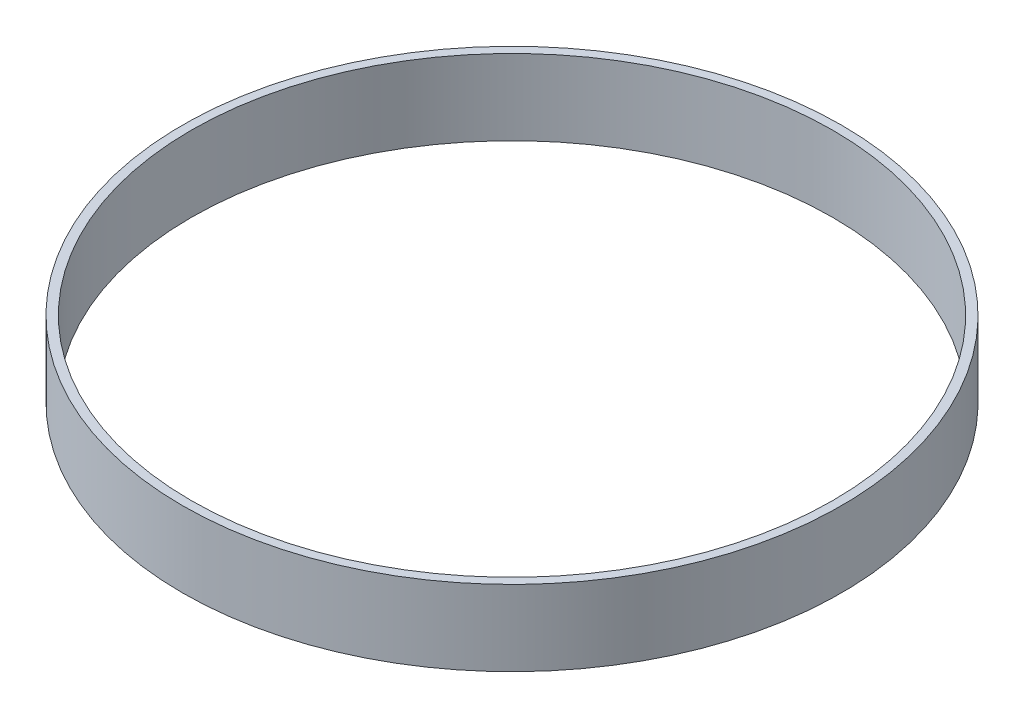
ISO-10303-21;
HEADER;
FILE_DESCRIPTION(('STEP AP214'),'2;1');
FILE_NAME('part.step','',(''),(''),'','','');
FILE_SCHEMA(('AUTOMOTIVE_DESIGN { 1 0 10303 214 1 1 1 1 }'));
ENDSEC;
DATA;
#1=APPLICATION_CONTEXT('core data for automotive mechanical design processes');
#2=APPLICATION_PROTOCOL_DEFINITION('international standard','automotive_design',2000,#1);
#3=PRODUCT_CONTEXT('',#1,'mechanical');
#4=PRODUCT('Part','Part','',(#3));
#5=PRODUCT_RELATED_PRODUCT_CATEGORY('part','',(#4));
#6=PRODUCT_DEFINITION_FORMATION('','',#4);
#7=PRODUCT_DEFINITION_CONTEXT('part definition',#1,'design');
#8=PRODUCT_DEFINITION('design','',#6,#7);
#9=PRODUCT_DEFINITION_SHAPE('','',#8);
#10=(LENGTH_UNIT() NAMED_UNIT(*) SI_UNIT(.MILLI.,.METRE.));
#11=(NAMED_UNIT(*) PLANE_ANGLE_UNIT() SI_UNIT($,.RADIAN.));
#12=(NAMED_UNIT(*) SI_UNIT($,.STERADIAN.) SOLID_ANGLE_UNIT());
#13=UNCERTAINTY_MEASURE_WITH_UNIT(LENGTH_MEASURE(1.E-05),#10,'distance_accuracy_value','');
#14=(GEOMETRIC_REPRESENTATION_CONTEXT(3) GLOBAL_UNCERTAINTY_ASSIGNED_CONTEXT((#13)) GLOBAL_UNIT_ASSIGNED_CONTEXT((#10,
#11,#12)) REPRESENTATION_CONTEXT('',''));
#15=CARTESIAN_POINT('',(0.,0.,0.));
#16=DIRECTION('',(0.,0.,1.));
#17=DIRECTION('',(1.,0.,0.));
#18=AXIS2_PLACEMENT_3D('',#15,#16,#17);
#19=CARTESIAN_POINT('',(0.,0.,0.));
#20=DIRECTION('',(0.,-1.,0.));
#21=DIRECTION('',(0.,0.,-1.));
#22=AXIS2_PLACEMENT_3D('',#19,#20,#21);
#23=CYLINDRICAL_SURFACE('',#22,73.);
#24=CARTESIAN_POINT('',(0.,17.2,0.));
#25=DIRECTION('',(0.,-1.,0.));
#26=DIRECTION('',(0.,0.,-1.));
#27=AXIS2_PLACEMENT_3D('',#24,#25,#26);
#28=CIRCLE('',#27,73.);
#29=CARTESIAN_POINT('',(0.,17.2,-73.));
#30=VERTEX_POINT('',#29);
#31=EDGE_CURVE('E45',#30,#30,#28,.T.);
#32=ORIENTED_EDGE('',*,*,#31,.F.);
#33=EDGE_LOOP('',(#32));
#34=FACE_BOUND('',#33,.T.);
#35=CARTESIAN_POINT('',(0.,0.,0.));
#36=DIRECTION('',(0.,-1.,0.));
#37=DIRECTION('',(0.,0.,-1.));
#38=AXIS2_PLACEMENT_3D('',#35,#36,#37);
#39=CIRCLE('',#38,73.);
#40=CARTESIAN_POINT('',(0.,0.,-73.));
#41=VERTEX_POINT('',#40);
#42=EDGE_CURVE('E10',#41,#41,#39,.T.);
#43=ORIENTED_EDGE('',*,*,#42,.T.);
#44=EDGE_LOOP('',(#43));
#45=FACE_BOUND('',#44,.T.);
#46=ADVANCED_FACE('F31',(#34,#45),#23,.F.);
#47=CARTESIAN_POINT('',(-73.,0.,0.));
#48=DIRECTION('',(0.,1.,0.));
#49=DIRECTION('',(0.,0.,1.));
#50=AXIS2_PLACEMENT_3D('',#47,#48,#49);
#51=PLANE('',#50);
#52=ORIENTED_EDGE('',*,*,#42,.F.);
#53=EDGE_LOOP('',(#52));
#54=FACE_BOUND('',#53,.T.);
#55=CARTESIAN_POINT('',(0.,0.,0.));
#56=DIRECTION('',(0.,-1.,0.));
#57=DIRECTION('',(0.,0.,-1.));
#58=AXIS2_PLACEMENT_3D('',#55,#56,#57);
#59=CIRCLE('',#58,75.);
#60=CARTESIAN_POINT('',(0.,0.,-75.));
#61=VERTEX_POINT('',#60);
#62=EDGE_CURVE('E37',#61,#61,#59,.T.);
#63=ORIENTED_EDGE('',*,*,#62,.T.);
#64=EDGE_LOOP('',(#63));
#65=FACE_BOUND('',#64,.T.);
#66=ADVANCED_FACE('F54',(#54,#65),#51,.F.);
#67=CARTESIAN_POINT('',(0.,0.,0.));
#68=DIRECTION('',(0.,-1.,0.));
#69=DIRECTION('',(0.,0.,-1.));
#70=AXIS2_PLACEMENT_3D('',#67,#68,#69);
#71=CYLINDRICAL_SURFACE('',#70,75.);
#72=ORIENTED_EDGE('',*,*,#62,.F.);
#73=EDGE_LOOP('',(#72));
#74=FACE_BOUND('',#73,.T.);
#75=CARTESIAN_POINT('',(0.,17.2,0.));
#76=DIRECTION('',(0.,-1.,0.));
#77=DIRECTION('',(0.,0.,-1.));
#78=AXIS2_PLACEMENT_3D('',#75,#76,#77);
#79=CIRCLE('',#78,75.);
#80=CARTESIAN_POINT('',(0.,17.2,-75.));
#81=VERTEX_POINT('',#80);
#82=EDGE_CURVE('E41',#81,#81,#79,.T.);
#83=ORIENTED_EDGE('',*,*,#82,.T.);
#84=EDGE_LOOP('',(#83));
#85=FACE_BOUND('',#84,.T.);
#86=ADVANCED_FACE('F58',(#74,#85),#71,.T.);
#87=CARTESIAN_POINT('',(-75.,17.2,0.));
#88=DIRECTION('',(0.,-1.,0.));
#89=DIRECTION('',(0.,0.,-1.));
#90=AXIS2_PLACEMENT_3D('',#87,#88,#89);
#91=PLANE('',#90);
#92=ORIENTED_EDGE('',*,*,#82,.F.);
#93=EDGE_LOOP('',(#92));
#94=FACE_BOUND('',#93,.T.);
#95=ORIENTED_EDGE('',*,*,#31,.T.);
#96=EDGE_LOOP('',(#95));
#97=FACE_BOUND('',#96,.T.);
#98=ADVANCED_FACE('F51',(#94,#97),#91,.F.);
#99=CLOSED_SHELL('',(#46,#66,#86,#98));
#100=MANIFOLD_SOLID_BREP('B2',#99);
#101=ADVANCED_BREP_SHAPE_REPRESENTATION('',(#18,#100),#14);
#102=SHAPE_DEFINITION_REPRESENTATION(#9,#101);
ENDSEC;
END-ISO-10303-21;
